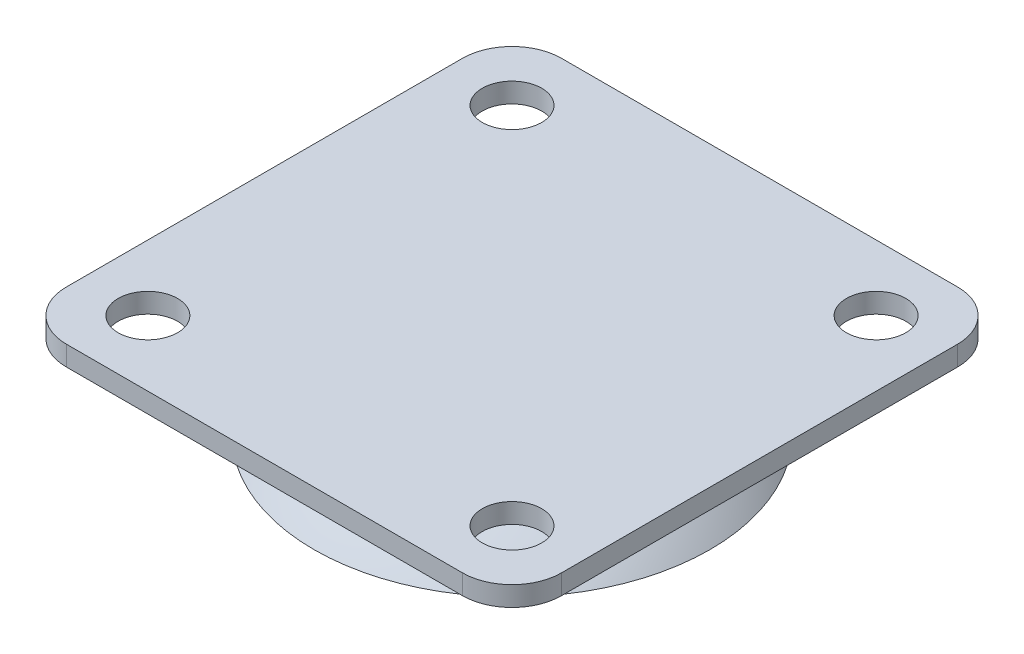
ISO-10303-21;
HEADER;
FILE_DESCRIPTION(('STEP AP214'),'2;1');
FILE_NAME('part.step','',(''),(''),'','','');
FILE_SCHEMA(('AUTOMOTIVE_DESIGN { 1 0 10303 214 1 1 1 1 }'));
ENDSEC;
DATA;
#1=APPLICATION_CONTEXT('core data for automotive mechanical design processes');
#2=APPLICATION_PROTOCOL_DEFINITION('international standard','automotive_design',2000,#1);
#3=PRODUCT_CONTEXT('',#1,'mechanical');
#4=PRODUCT('Part','Part','',(#3));
#5=PRODUCT_RELATED_PRODUCT_CATEGORY('part','',(#4));
#6=PRODUCT_DEFINITION_FORMATION('','',#4);
#7=PRODUCT_DEFINITION_CONTEXT('part definition',#1,'design');
#8=PRODUCT_DEFINITION('design','',#6,#7);
#9=PRODUCT_DEFINITION_SHAPE('','',#8);
#10=(LENGTH_UNIT() NAMED_UNIT(*) SI_UNIT(.MILLI.,.METRE.));
#11=(NAMED_UNIT(*) PLANE_ANGLE_UNIT() SI_UNIT($,.RADIAN.));
#12=(NAMED_UNIT(*) SI_UNIT($,.STERADIAN.) SOLID_ANGLE_UNIT());
#13=UNCERTAINTY_MEASURE_WITH_UNIT(LENGTH_MEASURE(1.E-05),#10,'distance_accuracy_value','');
#14=(GEOMETRIC_REPRESENTATION_CONTEXT(3) GLOBAL_UNCERTAINTY_ASSIGNED_CONTEXT((#13)) GLOBAL_UNIT_ASSIGNED_CONTEXT((#10,
#11,#12)) REPRESENTATION_CONTEXT('',''));
#15=CARTESIAN_POINT('',(0.,0.,0.));
#16=DIRECTION('',(0.,0.,1.));
#17=DIRECTION('',(1.,0.,0.));
#18=AXIS2_PLACEMENT_3D('',#15,#16,#17);
#19=CARTESIAN_POINT('',(0.,-2.01998092078022,0.));
#20=DIRECTION('',(0.,-1.,0.));
#21=DIRECTION('',(1.,0.,0.));
#22=AXIS2_PLACEMENT_3D('',#19,#20,#21);
#23=CONICAL_SURFACE('',#22,0.,1.54445985501859);
#24=CARTESIAN_POINT('',(0.,-2.07264777546617,0.));
#25=DIRECTION('',(0.,1.,0.));
#26=DIRECTION('',(-1.,0.,0.));
#27=AXIS2_PLACEMENT_3D('',#24,#25,#26);
#28=CIRCLE('',#27,1.99930643034466);
#29=CARTESIAN_POINT('',(-1.99930643034465,-2.07264777546617,0.));
#30=VERTEX_POINT('',#29);
#31=EDGE_CURVE('E12',#30,#30,#28,.T.);
#32=ORIENTED_EDGE('',*,*,#31,.F.);
#33=EDGE_LOOP('',(#32));
#34=FACE_BOUND('',#33,.T.);
#35=CARTESIAN_POINT('',(0.,-2.01998092078022,0.));
#36=VERTEX_POINT('',#35);
#37=VERTEX_LOOP('',#36);
#38=FACE_BOUND('',#37,.T.);
#39=ADVANCED_FACE('F44',(#34,#38),#23,.F.);
#40=CARTESIAN_POINT('',(1.99930643034296,-2.07264777546864,0.));
#41=CARTESIAN_POINT('',(2.66600766577475,-2.11729166220924,0.));
#42=CARTESIAN_POINT('',(4.01401916836039,-2.25161643467983,0.));
#43=CARTESIAN_POINT('',(6.54949998201587,-2.68338834364569,0.));
#44=CARTESIAN_POINT('',(9.52540791491086,-3.53379938436984,0.));
#45=CARTESIAN_POINT('',(12.7653946172974,-5.03564881742584,0.));
#46=CARTESIAN_POINT('',(14.7494498183649,-6.38036587132119,0.));
#47=CARTESIAN_POINT('',(15.6790017267229,-7.12439916746116,0.));
#48=B_SPLINE_CURVE_WITH_KNOTS('',3,(#40,#41,#42,#43,#44,#45,#46,#47),.UNSPECIFIED.,.F.,.F.,(4,1,
1,1,1,4),(0.0872314803986125,0.177417467087911,0.26760345377721,0.447975427155807,
0.628347400534404,0.808719373913002),.UNSPECIFIED.);
#49=CARTESIAN_POINT('',(0.,10.0059537659192,0.));
#50=DIRECTION('',(0.,1.,0.));
#51=AXIS1_PLACEMENT('',#49,#50);
#52=SURFACE_OF_REVOLUTION('',#48,#51);
#53=CARTESIAN_POINT('',(0.,-7.12439916746116,0.));
#54=DIRECTION('',(0.,1.,0.));
#55=DIRECTION('',(-1.,0.,0.));
#56=AXIS2_PLACEMENT_3D('',#53,#54,#55);
#57=CIRCLE('',#56,15.6790017267229);
#58=CARTESIAN_POINT('',(-15.6790017267229,-7.12439916746116,0.));
#59=VERTEX_POINT('',#58);
#60=EDGE_CURVE('E51',#59,#59,#57,.T.);
#61=ORIENTED_EDGE('',*,*,#60,.F.);
#62=EDGE_LOOP('',(#61));
#63=FACE_BOUND('',#62,.T.);
#64=ORIENTED_EDGE('',*,*,#31,.T.);
#65=EDGE_LOOP('',(#64));
#66=FACE_BOUND('',#65,.T.);
#67=ADVANCED_FACE('F71',(#63,#66),#52,.T.);
#68=CARTESIAN_POINT('',(0.,-7.12439916746116,0.));
#69=DIRECTION('',(0.,-1.,0.));
#70=DIRECTION('',(1.,0.,0.));
#71=AXIS2_PLACEMENT_3D('',#68,#69,#70);
#72=CONICAL_SURFACE('',#71,15.6790017267229,0.834112174074642);
#73=CARTESIAN_POINT('',(0.,-8.46807028808528,0.));
#74=DIRECTION('',(0.,1.,0.));
#75=DIRECTION('',(-1.,0.,0.));
#76=AXIS2_PLACEMENT_3D('',#73,#74,#75);
#77=CIRCLE('',#76,17.1604023881244);
#78=CARTESIAN_POINT('',(-17.1604023881244,-8.46807028808528,0.));
#79=VERTEX_POINT('',#78);
#80=EDGE_CURVE('E101',#79,#79,#77,.T.);
#81=ORIENTED_EDGE('',*,*,#80,.F.);
#82=EDGE_LOOP('',(#81));
#83=FACE_BOUND('',#82,.T.);
#84=ORIENTED_EDGE('',*,*,#60,.T.);
#85=EDGE_LOOP('',(#84));
#86=FACE_BOUND('',#85,.T.);
#87=ADVANCED_FACE('F65',(#83,#86),#72,.F.);
#88=CARTESIAN_POINT('',(0.,-8.46807028808527,0.));
#89=DIRECTION('',(0.,-1.,0.));
#90=DIRECTION('',(1.,0.,0.));
#91=AXIS2_PLACEMENT_3D('',#88,#89,#90);
#92=PLANE('',#91);
#93=ORIENTED_EDGE('',*,*,#80,.T.);
#94=EDGE_LOOP('',(#93));
#95=FACE_BOUND('',#94,.T.);
#96=CARTESIAN_POINT('',(0.,-8.46807028808528,0.));
#97=DIRECTION('',(0.,1.,0.));
#98=DIRECTION('',(-1.,0.,0.));
#99=AXIS2_PLACEMENT_3D('',#96,#97,#98);
#100=CIRCLE('',#99,20.);
#101=CARTESIAN_POINT('',(-20.,-8.46807028808528,0.));
#102=VERTEX_POINT('',#101);
#103=EDGE_CURVE('E96',#102,#102,#100,.T.);
#104=ORIENTED_EDGE('',*,*,#103,.F.);
#105=EDGE_LOOP('',(#104));
#106=FACE_BOUND('',#105,.T.);
#107=ADVANCED_FACE('F59',(#95,#106),#92,.T.);
#108=CARTESIAN_POINT('',(0.,0.,0.));
#109=CARTESIAN_POINT('',(12.4384062197787,-0.0796283350425367,0.));
#110=CARTESIAN_POINT('',(20.,-8.46807028808527,0.));
#111=B_SPLINE_CURVE_WITH_KNOTS('',2,(#108,#109,#110),.UNSPECIFIED.,.F.,.F.,(3,3),(0.,1.),.UNSPECIFIED.);
#112=CARTESIAN_POINT('',(0.,10.0059537659192,0.));
#113=DIRECTION('',(0.,1.,0.));
#114=AXIS1_PLACEMENT('',#112,#113);
#115=SURFACE_OF_REVOLUTION('',#111,#114);
#116=ORIENTED_EDGE('',*,*,#103,.T.);
#117=EDGE_LOOP('',(#116));
#118=FACE_BOUND('',#117,.T.);
#119=CARTESIAN_POINT('',(0.,0.,0.));
#120=VERTEX_POINT('',#119);
#121=VERTEX_LOOP('',#120);
#122=FACE_BOUND('',#121,.T.);
#123=ADVANCED_FACE('F57',(#118,#122),#115,.F.);
#124=CLOSED_SHELL('',(#39,#67,#87,#107,#123));
#125=MANIFOLD_SOLID_BREP('B2',#124);
#126=CARTESIAN_POINT('',(0.,2.,0.));
#127=DIRECTION('',(0.,1.,0.));
#128=DIRECTION('',(0.,0.,1.));
#129=AXIS2_PLACEMENT_3D('',#126,#127,#128);
#130=PLANE('',#129);
#131=CARTESIAN_POINT('',(18.3847763108502,2.,18.3847763108502));
#132=DIRECTION('',(0.,1.,0.));
#133=DIRECTION('',(0.,0.,-1.));
#134=AXIS2_PLACEMENT_3D('',#131,#132,#133);
#135=CIRCLE('',#134,2.99999999999999);
#136=CARTESIAN_POINT('',(18.3847763108502,2.,15.3847763108502));
#137=VERTEX_POINT('',#136);
#138=EDGE_CURVE('E287',#137,#137,#135,.T.);
#139=ORIENTED_EDGE('',*,*,#138,.F.);
#140=EDGE_LOOP('',(#139));
#141=FACE_BOUND('',#140,.T.);
#142=CARTESIAN_POINT('',(18.3847763108502,2.,-18.3847763108502));
#143=DIRECTION('',(0.,1.,0.));
#144=DIRECTION('',(0.,0.,1.));
#145=AXIS2_PLACEMENT_3D('',#142,#143,#144);
#146=CIRCLE('',#145,2.99999999999999);
#147=CARTESIAN_POINT('',(18.3847763108502,2.,-15.3847763108502));
#148=VERTEX_POINT('',#147);
#149=EDGE_CURVE('E228',#148,#148,#146,.T.);
#150=ORIENTED_EDGE('',*,*,#149,.F.);
#151=EDGE_LOOP('',(#150));
#152=FACE_BOUND('',#151,.T.);
#153=DIRECTION('',(1.,0.,0.));
#154=VECTOR('',#153,1.);
#155=CARTESIAN_POINT('',(-25.,2.,25.));
#156=LINE('',#155,#154);
#157=CARTESIAN_POINT('',(-20.,2.,25.));
#158=VERTEX_POINT('',#157);
#159=CARTESIAN_POINT('',(20.,2.,25.));
#160=VERTEX_POINT('',#159);
#161=EDGE_CURVE('E237',#158,#160,#156,.T.);
#162=ORIENTED_EDGE('',*,*,#161,.T.);
#163=CARTESIAN_POINT('',(20.,2.,20.));
#164=DIRECTION('',(0.,1.,0.));
#165=DIRECTION('',(0.,0.,1.));
#166=AXIS2_PLACEMENT_3D('',#163,#164,#165);
#167=CIRCLE('',#166,5.);
#168=CARTESIAN_POINT('',(25.,2.,20.));
#169=VERTEX_POINT('',#168);
#170=EDGE_CURVE('E256',#160,#169,#167,.T.);
#171=ORIENTED_EDGE('',*,*,#170,.T.);
#172=DIRECTION('',(0.,0.,-1.));
#173=VECTOR('',#172,1.);
#174=CARTESIAN_POINT('',(25.,2.,-25.));
#175=LINE('',#174,#173);
#176=CARTESIAN_POINT('',(25.,2.,-20.));
#177=VERTEX_POINT('',#176);
#178=EDGE_CURVE('E220',#169,#177,#175,.T.);
#179=ORIENTED_EDGE('',*,*,#178,.T.);
#180=CARTESIAN_POINT('',(20.,2.,-20.));
#181=DIRECTION('',(0.,1.,0.));
#182=DIRECTION('',(0.,0.,1.));
#183=AXIS2_PLACEMENT_3D('',#180,#181,#182);
#184=CIRCLE('',#183,5.);
#185=CARTESIAN_POINT('',(20.,2.,-25.));
#186=VERTEX_POINT('',#185);
#187=EDGE_CURVE('E251',#177,#186,#184,.T.);
#188=ORIENTED_EDGE('',*,*,#187,.T.);
#189=DIRECTION('',(-1.,0.,0.));
#190=VECTOR('',#189,1.);
#191=CARTESIAN_POINT('',(-25.,2.,-25.));
#192=LINE('',#191,#190);
#193=CARTESIAN_POINT('',(-20.,2.,-25.));
#194=VERTEX_POINT('',#193);
#195=EDGE_CURVE('E267',#186,#194,#192,.T.);
#196=ORIENTED_EDGE('',*,*,#195,.T.);
#197=CARTESIAN_POINT('',(-20.,2.,-20.));
#198=DIRECTION('',(0.,1.,0.));
#199=DIRECTION('',(0.,0.,1.));
#200=AXIS2_PLACEMENT_3D('',#197,#198,#199);
#201=CIRCLE('',#200,5.);
#202=CARTESIAN_POINT('',(-25.,2.,-20.));
#203=VERTEX_POINT('',#202);
#204=EDGE_CURVE('E156',#194,#203,#201,.T.);
#205=ORIENTED_EDGE('',*,*,#204,.T.);
#206=DIRECTION('',(0.,0.,1.));
#207=VECTOR('',#206,1.);
#208=CARTESIAN_POINT('',(-25.,2.,-25.));
#209=LINE('',#208,#207);
#210=CARTESIAN_POINT('',(-25.,2.,20.));
#211=VERTEX_POINT('',#210);
#212=EDGE_CURVE('E275',#203,#211,#209,.T.);
#213=ORIENTED_EDGE('',*,*,#212,.T.);
#214=CARTESIAN_POINT('',(-20.,2.,20.));
#215=DIRECTION('',(0.,1.,0.));
#216=DIRECTION('',(0.,0.,1.));
#217=AXIS2_PLACEMENT_3D('',#214,#215,#216);
#218=CIRCLE('',#217,5.);
#219=EDGE_CURVE('E254',#211,#158,#218,.T.);
#220=ORIENTED_EDGE('',*,*,#219,.T.);
#221=EDGE_LOOP('',(#162,#171,#179,#188,#196,#205,#213,#220));
#222=FACE_BOUND('',#221,.T.);
#223=CARTESIAN_POINT('',(-18.3847763108502,2.,-18.3847763108502));
#224=DIRECTION('',(0.,1.,0.));
#225=DIRECTION('',(0.,0.,-1.));
#226=AXIS2_PLACEMENT_3D('',#223,#224,#225);
#227=CIRCLE('',#226,2.99999999999999);
#228=CARTESIAN_POINT('',(-18.3847763108502,2.,-21.3847763108502));
#229=VERTEX_POINT('',#228);
#230=EDGE_CURVE('E282',#229,#229,#227,.T.);
#231=ORIENTED_EDGE('',*,*,#230,.F.);
#232=EDGE_LOOP('',(#231));
#233=FACE_BOUND('',#232,.T.);
#234=CARTESIAN_POINT('',(-18.3847763108502,2.,18.3847763108502));
#235=DIRECTION('',(0.,1.,0.));
#236=DIRECTION('',(0.,0.,1.));
#237=AXIS2_PLACEMENT_3D('',#234,#235,#236);
#238=CIRCLE('',#237,2.99999999999999);
#239=CARTESIAN_POINT('',(-18.3847763108502,2.,21.3847763108502));
#240=VERTEX_POINT('',#239);
#241=EDGE_CURVE('E293',#240,#240,#238,.T.);
#242=ORIENTED_EDGE('',*,*,#241,.F.);
#243=EDGE_LOOP('',(#242));
#244=FACE_BOUND('',#243,.T.);
#245=ADVANCED_FACE('F134',(#141,#152,#222,#233,#244),#130,.T.);
#246=CARTESIAN_POINT('',(0.,0.,0.));
#247=DIRECTION('',(0.,1.,0.));
#248=DIRECTION('',(0.,0.,1.));
#249=AXIS2_PLACEMENT_3D('',#246,#247,#248);
#250=PLANE('',#249);
#251=DIRECTION('',(0.,0.,-1.));
#252=VECTOR('',#251,1.);
#253=CARTESIAN_POINT('',(25.,0.,-25.));
#254=LINE('',#253,#252);
#255=CARTESIAN_POINT('',(25.,0.,20.));
#256=VERTEX_POINT('',#255);
#257=CARTESIAN_POINT('',(25.,0.,-20.));
#258=VERTEX_POINT('',#257);
#259=EDGE_CURVE('E217',#256,#258,#254,.T.);
#260=ORIENTED_EDGE('',*,*,#259,.F.);
#261=CARTESIAN_POINT('',(20.,0.,20.));
#262=DIRECTION('',(0.,1.,0.));
#263=DIRECTION('',(0.,0.,1.));
#264=AXIS2_PLACEMENT_3D('',#261,#262,#263);
#265=CIRCLE('',#264,5.);
#266=CARTESIAN_POINT('',(20.,0.,25.));
#267=VERTEX_POINT('',#266);
#268=EDGE_CURVE('E200',#256,#267,#265,.F.);
#269=ORIENTED_EDGE('',*,*,#268,.T.);
#270=DIRECTION('',(1.,0.,0.));
#271=VECTOR('',#270,1.);
#272=CARTESIAN_POINT('',(-25.,0.,25.));
#273=LINE('',#272,#271);
#274=CARTESIAN_POINT('',(-20.,0.,25.));
#275=VERTEX_POINT('',#274);
#276=EDGE_CURVE('E241',#275,#267,#273,.T.);
#277=ORIENTED_EDGE('',*,*,#276,.F.);
#278=CARTESIAN_POINT('',(-20.,0.,20.));
#279=DIRECTION('',(0.,1.,0.));
#280=DIRECTION('',(0.,0.,1.));
#281=AXIS2_PLACEMENT_3D('',#278,#279,#280);
#282=CIRCLE('',#281,5.);
#283=CARTESIAN_POINT('',(-25.,0.,20.));
#284=VERTEX_POINT('',#283);
#285=EDGE_CURVE('E211',#275,#284,#282,.F.);
#286=ORIENTED_EDGE('',*,*,#285,.T.);
#287=DIRECTION('',(0.,0.,1.));
#288=VECTOR('',#287,1.);
#289=CARTESIAN_POINT('',(-25.,0.,-25.));
#290=LINE('',#289,#288);
#291=CARTESIAN_POINT('',(-25.,0.,-20.));
#292=VERTEX_POINT('',#291);
#293=EDGE_CURVE('E231',#292,#284,#290,.T.);
#294=ORIENTED_EDGE('',*,*,#293,.F.);
#295=CARTESIAN_POINT('',(-20.,0.,-20.));
#296=DIRECTION('',(0.,1.,0.));
#297=DIRECTION('',(0.,0.,1.));
#298=AXIS2_PLACEMENT_3D('',#295,#296,#297);
#299=CIRCLE('',#298,5.);
#300=CARTESIAN_POINT('',(-20.,0.,-25.));
#301=VERTEX_POINT('',#300);
#302=EDGE_CURVE('E245',#292,#301,#299,.F.);
#303=ORIENTED_EDGE('',*,*,#302,.T.);
#304=DIRECTION('',(-1.,0.,0.));
#305=VECTOR('',#304,1.);
#306=CARTESIAN_POINT('',(-25.,0.,-25.));
#307=LINE('',#306,#305);
#308=CARTESIAN_POINT('',(20.,0.,-25.));
#309=VERTEX_POINT('',#308);
#310=EDGE_CURVE('E227',#309,#301,#307,.T.);
#311=ORIENTED_EDGE('',*,*,#310,.F.);
#312=CARTESIAN_POINT('',(20.,0.,-20.));
#313=DIRECTION('',(0.,1.,0.));
#314=DIRECTION('',(0.,0.,1.));
#315=AXIS2_PLACEMENT_3D('',#312,#313,#314);
#316=CIRCLE('',#315,5.);
#317=EDGE_CURVE('E221',#309,#258,#316,.F.);
#318=ORIENTED_EDGE('',*,*,#317,.T.);
#319=EDGE_LOOP('',(#260,#269,#277,#286,#294,#303,#311,#318));
#320=FACE_BOUND('',#319,.T.);
#321=CARTESIAN_POINT('',(18.3847763108502,0.,-18.3847763108502));
#322=DIRECTION('',(0.,1.,0.));
#323=DIRECTION('',(0.,0.,1.));
#324=AXIS2_PLACEMENT_3D('',#321,#322,#323);
#325=CIRCLE('',#324,2.99999999999999);
#326=CARTESIAN_POINT('',(18.3847763108502,0.,-15.3847763108502));
#327=VERTEX_POINT('',#326);
#328=EDGE_CURVE('E234',#327,#327,#325,.T.);
#329=ORIENTED_EDGE('',*,*,#328,.T.);
#330=EDGE_LOOP('',(#329));
#331=FACE_BOUND('',#330,.T.);
#332=CARTESIAN_POINT('',(-18.3847763108502,0.,-18.3847763108502));
#333=DIRECTION('',(0.,1.,0.));
#334=DIRECTION('',(0.,0.,-1.));
#335=AXIS2_PLACEMENT_3D('',#332,#333,#334);
#336=CIRCLE('',#335,2.99999999999999);
#337=CARTESIAN_POINT('',(-18.3847763108502,0.,-21.3847763108502));
#338=VERTEX_POINT('',#337);
#339=EDGE_CURVE('E284',#338,#338,#336,.T.);
#340=ORIENTED_EDGE('',*,*,#339,.T.);
#341=EDGE_LOOP('',(#340));
#342=FACE_BOUND('',#341,.T.);
#343=CARTESIAN_POINT('',(18.3847763108502,0.,18.3847763108502));
#344=DIRECTION('',(0.,1.,0.));
#345=DIRECTION('',(0.,0.,-1.));
#346=AXIS2_PLACEMENT_3D('',#343,#344,#345);
#347=CIRCLE('',#346,2.99999999999999);
#348=CARTESIAN_POINT('',(18.3847763108502,0.,15.3847763108502));
#349=VERTEX_POINT('',#348);
#350=EDGE_CURVE('E290',#349,#349,#347,.T.);
#351=ORIENTED_EDGE('',*,*,#350,.T.);
#352=EDGE_LOOP('',(#351));
#353=FACE_BOUND('',#352,.T.);
#354=CARTESIAN_POINT('',(-18.3847763108502,0.,18.3847763108502));
#355=DIRECTION('',(0.,1.,0.));
#356=DIRECTION('',(0.,0.,1.));
#357=AXIS2_PLACEMENT_3D('',#354,#355,#356);
#358=CIRCLE('',#357,2.99999999999999);
#359=CARTESIAN_POINT('',(-18.3847763108502,0.,21.3847763108502));
#360=VERTEX_POINT('',#359);
#361=EDGE_CURVE('E296',#360,#360,#358,.T.);
#362=ORIENTED_EDGE('',*,*,#361,.T.);
#363=EDGE_LOOP('',(#362));
#364=FACE_BOUND('',#363,.T.);
#365=ADVANCED_FACE('F224',(#320,#331,#342,#353,#364),#250,.F.);
#366=CARTESIAN_POINT('',(25.,2.,-25.));
#367=DIRECTION('',(-1.,0.,0.));
#368=DIRECTION('',(0.,0.,1.));
#369=AXIS2_PLACEMENT_3D('',#366,#367,#368);
#370=PLANE('',#369);
#371=ORIENTED_EDGE('',*,*,#178,.F.);
#372=DIRECTION('',(0.,-1.,0.));
#373=VECTOR('',#372,1.);
#374=CARTESIAN_POINT('',(25.,2.,20.));
#375=LINE('',#374,#373);
#376=EDGE_CURVE('E204',#169,#256,#375,.T.);
#377=ORIENTED_EDGE('',*,*,#376,.T.);
#378=ORIENTED_EDGE('',*,*,#259,.T.);
#379=DIRECTION('',(0.,-1.,0.));
#380=VECTOR('',#379,1.);
#381=CARTESIAN_POINT('',(25.,2.,-20.));
#382=LINE('',#381,#380);
#383=EDGE_CURVE('E222',#258,#177,#382,.F.);
#384=ORIENTED_EDGE('',*,*,#383,.T.);
#385=EDGE_LOOP('',(#371,#377,#378,#384));
#386=FACE_BOUND('',#385,.T.);
#387=ADVANCED_FACE('F216',(#386),#370,.F.);
#388=CARTESIAN_POINT('',(-25.,2.,-25.));
#389=DIRECTION('',(0.,0.,1.));
#390=DIRECTION('',(1.,0.,0.));
#391=AXIS2_PLACEMENT_3D('',#388,#389,#390);
#392=PLANE('',#391);
#393=ORIENTED_EDGE('',*,*,#310,.T.);
#394=DIRECTION('',(0.,-1.,0.));
#395=VECTOR('',#394,1.);
#396=CARTESIAN_POINT('',(-20.,2.,-25.));
#397=LINE('',#396,#395);
#398=EDGE_CURVE('E42',#301,#194,#397,.F.);
#399=ORIENTED_EDGE('',*,*,#398,.T.);
#400=ORIENTED_EDGE('',*,*,#195,.F.);
#401=DIRECTION('',(0.,-1.,0.));
#402=VECTOR('',#401,1.);
#403=CARTESIAN_POINT('',(20.,2.,-25.));
#404=LINE('',#403,#402);
#405=EDGE_CURVE('E142',#186,#309,#404,.T.);
#406=ORIENTED_EDGE('',*,*,#405,.T.);
#407=EDGE_LOOP('',(#393,#399,#400,#406));
#408=FACE_BOUND('',#407,.T.);
#409=ADVANCED_FACE('F265',(#408),#392,.F.);
#410=CARTESIAN_POINT('',(-25.,2.,-25.));
#411=DIRECTION('',(1.,0.,0.));
#412=DIRECTION('',(0.,0.,-1.));
#413=AXIS2_PLACEMENT_3D('',#410,#411,#412);
#414=PLANE('',#413);
#415=ORIENTED_EDGE('',*,*,#293,.T.);
#416=DIRECTION('',(0.,-1.,0.));
#417=VECTOR('',#416,1.);
#418=CARTESIAN_POINT('',(-25.,2.,20.));
#419=LINE('',#418,#417);
#420=EDGE_CURVE('E149',#284,#211,#419,.F.);
#421=ORIENTED_EDGE('',*,*,#420,.T.);
#422=ORIENTED_EDGE('',*,*,#212,.F.);
#423=DIRECTION('',(0.,-1.,0.));
#424=VECTOR('',#423,1.);
#425=CARTESIAN_POINT('',(-25.,2.,-20.));
#426=LINE('',#425,#424);
#427=EDGE_CURVE('E258',#203,#292,#426,.T.);
#428=ORIENTED_EDGE('',*,*,#427,.T.);
#429=EDGE_LOOP('',(#415,#421,#422,#428));
#430=FACE_BOUND('',#429,.T.);
#431=ADVANCED_FACE('F274',(#430),#414,.F.);
#432=CARTESIAN_POINT('',(-25.,2.,25.));
#433=DIRECTION('',(0.,0.,-1.));
#434=DIRECTION('',(-1.,0.,0.));
#435=AXIS2_PLACEMENT_3D('',#432,#433,#434);
#436=PLANE('',#435);
#437=ORIENTED_EDGE('',*,*,#276,.T.);
#438=DIRECTION('',(0.,-1.,0.));
#439=VECTOR('',#438,1.);
#440=CARTESIAN_POINT('',(20.,2.,25.));
#441=LINE('',#440,#439);
#442=EDGE_CURVE('E205',#267,#160,#441,.F.);
#443=ORIENTED_EDGE('',*,*,#442,.T.);
#444=ORIENTED_EDGE('',*,*,#161,.F.);
#445=DIRECTION('',(0.,-1.,0.));
#446=VECTOR('',#445,1.);
#447=CARTESIAN_POINT('',(-20.,2.,25.));
#448=LINE('',#447,#446);
#449=EDGE_CURVE('E210',#158,#275,#448,.T.);
#450=ORIENTED_EDGE('',*,*,#449,.T.);
#451=EDGE_LOOP('',(#437,#443,#444,#450));
#452=FACE_BOUND('',#451,.T.);
#453=ADVANCED_FACE('F318',(#452),#436,.F.);
#454=CARTESIAN_POINT('',(18.3847763108502,2.,-18.3847763108502));
#455=DIRECTION('',(0.,-1.,0.));
#456=DIRECTION('',(0.,0.,-1.));
#457=AXIS2_PLACEMENT_3D('',#454,#455,#456);
#458=CYLINDRICAL_SURFACE('',#457,2.99999999999999);
#459=ORIENTED_EDGE('',*,*,#149,.T.);
#460=EDGE_LOOP('',(#459));
#461=FACE_BOUND('',#460,.T.);
#462=ORIENTED_EDGE('',*,*,#328,.F.);
#463=EDGE_LOOP('',(#462));
#464=FACE_BOUND('',#463,.T.);
#465=ADVANCED_FACE('F315',(#461,#464),#458,.F.);
#466=CARTESIAN_POINT('',(-18.3847763108502,2.,-18.3847763108502));
#467=DIRECTION('',(0.,-1.,0.));
#468=DIRECTION('',(0.,0.,-1.));
#469=AXIS2_PLACEMENT_3D('',#466,#467,#468);
#470=CYLINDRICAL_SURFACE('',#469,2.99999999999999);
#471=ORIENTED_EDGE('',*,*,#230,.T.);
#472=EDGE_LOOP('',(#471));
#473=FACE_BOUND('',#472,.T.);
#474=ORIENTED_EDGE('',*,*,#339,.F.);
#475=EDGE_LOOP('',(#474));
#476=FACE_BOUND('',#475,.T.);
#477=ADVANCED_FACE('F344',(#473,#476),#470,.F.);
#478=CARTESIAN_POINT('',(18.3847763108502,2.,18.3847763108502));
#479=DIRECTION('',(0.,-1.,0.));
#480=DIRECTION('',(0.,0.,-1.));
#481=AXIS2_PLACEMENT_3D('',#478,#479,#480);
#482=CYLINDRICAL_SURFACE('',#481,2.99999999999999);
#483=ORIENTED_EDGE('',*,*,#138,.T.);
#484=EDGE_LOOP('',(#483));
#485=FACE_BOUND('',#484,.T.);
#486=ORIENTED_EDGE('',*,*,#350,.F.);
#487=EDGE_LOOP('',(#486));
#488=FACE_BOUND('',#487,.T.);
#489=ADVANCED_FACE('F347',(#485,#488),#482,.F.);
#490=CARTESIAN_POINT('',(-18.3847763108502,2.,18.3847763108502));
#491=DIRECTION('',(0.,-1.,0.));
#492=DIRECTION('',(0.,0.,-1.));
#493=AXIS2_PLACEMENT_3D('',#490,#491,#492);
#494=CYLINDRICAL_SURFACE('',#493,2.99999999999999);
#495=ORIENTED_EDGE('',*,*,#241,.T.);
#496=EDGE_LOOP('',(#495));
#497=FACE_BOUND('',#496,.T.);
#498=ORIENTED_EDGE('',*,*,#361,.F.);
#499=EDGE_LOOP('',(#498));
#500=FACE_BOUND('',#499,.T.);
#501=ADVANCED_FACE('F302',(#497,#500),#494,.F.);
#502=CARTESIAN_POINT('',(20.,2.,20.));
#503=DIRECTION('',(0.,-1.,0.));
#504=DIRECTION('',(0.,0.,-1.));
#505=AXIS2_PLACEMENT_3D('',#502,#503,#504);
#506=CYLINDRICAL_SURFACE('',#505,5.);
#507=ORIENTED_EDGE('',*,*,#170,.F.);
#508=ORIENTED_EDGE('',*,*,#442,.F.);
#509=ORIENTED_EDGE('',*,*,#268,.F.);
#510=ORIENTED_EDGE('',*,*,#376,.F.);
#511=EDGE_LOOP('',(#507,#508,#509,#510));
#512=FACE_BOUND('',#511,.T.);
#513=ADVANCED_FACE('F203',(#512),#506,.T.);
#514=CARTESIAN_POINT('',(-20.,2.,20.));
#515=DIRECTION('',(0.,-1.,0.));
#516=DIRECTION('',(0.,0.,-1.));
#517=AXIS2_PLACEMENT_3D('',#514,#515,#516);
#518=CYLINDRICAL_SURFACE('',#517,5.);
#519=ORIENTED_EDGE('',*,*,#219,.F.);
#520=ORIENTED_EDGE('',*,*,#420,.F.);
#521=ORIENTED_EDGE('',*,*,#285,.F.);
#522=ORIENTED_EDGE('',*,*,#449,.F.);
#523=EDGE_LOOP('',(#519,#520,#521,#522));
#524=FACE_BOUND('',#523,.T.);
#525=ADVANCED_FACE('F330',(#524),#518,.T.);
#526=CARTESIAN_POINT('',(-20.,2.,-20.));
#527=DIRECTION('',(0.,-1.,0.));
#528=DIRECTION('',(0.,0.,-1.));
#529=AXIS2_PLACEMENT_3D('',#526,#527,#528);
#530=CYLINDRICAL_SURFACE('',#529,5.);
#531=ORIENTED_EDGE('',*,*,#204,.F.);
#532=ORIENTED_EDGE('',*,*,#398,.F.);
#533=ORIENTED_EDGE('',*,*,#302,.F.);
#534=ORIENTED_EDGE('',*,*,#427,.F.);
#535=EDGE_LOOP('',(#531,#532,#533,#534));
#536=FACE_BOUND('',#535,.T.);
#537=ADVANCED_FACE('F273',(#536),#530,.T.);
#538=CARTESIAN_POINT('',(20.,2.,-20.));
#539=DIRECTION('',(0.,-1.,0.));
#540=DIRECTION('',(0.,0.,-1.));
#541=AXIS2_PLACEMENT_3D('',#538,#539,#540);
#542=CYLINDRICAL_SURFACE('',#541,5.);
#543=ORIENTED_EDGE('',*,*,#187,.F.);
#544=ORIENTED_EDGE('',*,*,#383,.F.);
#545=ORIENTED_EDGE('',*,*,#317,.F.);
#546=ORIENTED_EDGE('',*,*,#405,.F.);
#547=EDGE_LOOP('',(#543,#544,#545,#546));
#548=FACE_BOUND('',#547,.T.);
#549=ADVANCED_FACE('F136',(#548),#542,.T.);
#550=CLOSED_SHELL('',(#245,#365,#387,#409,#431,#453,#465,#477,#489,#501,#513,#525,#537,#549));
#551=MANIFOLD_SOLID_BREP('B6',#550);
#552=ADVANCED_BREP_SHAPE_REPRESENTATION('',(#18,#125,#551),#14);
#553=SHAPE_DEFINITION_REPRESENTATION(#9,#552);
ENDSEC;
END-ISO-10303-21;
